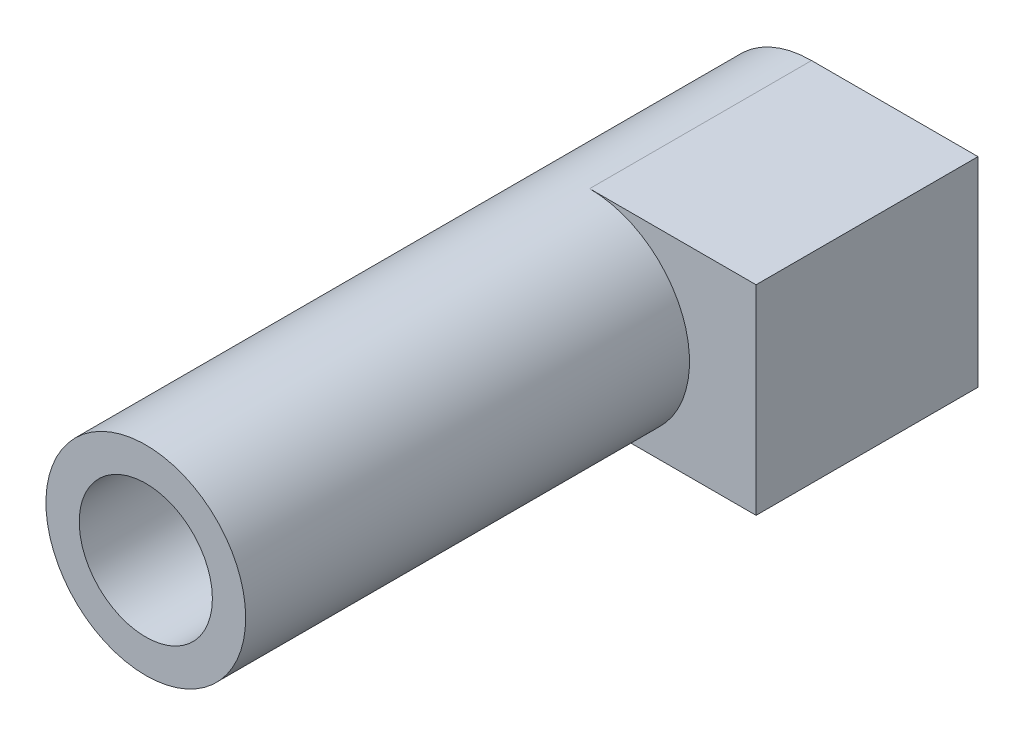
ISO-10303-21;
HEADER;
FILE_DESCRIPTION(('STEP AP214'),'2;1');
FILE_NAME('part.step','',(''),(''),'','','');
FILE_SCHEMA(('AUTOMOTIVE_DESIGN { 1 0 10303 214 1 1 1 1 }'));
ENDSEC;
DATA;
#1=APPLICATION_CONTEXT('core data for automotive mechanical design processes');
#2=APPLICATION_PROTOCOL_DEFINITION('international standard','automotive_design',2000,#1);
#3=PRODUCT_CONTEXT('',#1,'mechanical');
#4=PRODUCT('Part','Part','',(#3));
#5=PRODUCT_RELATED_PRODUCT_CATEGORY('part','',(#4));
#6=PRODUCT_DEFINITION_FORMATION('','',#4);
#7=PRODUCT_DEFINITION_CONTEXT('part definition',#1,'design');
#8=PRODUCT_DEFINITION('design','',#6,#7);
#9=PRODUCT_DEFINITION_SHAPE('','',#8);
#10=(LENGTH_UNIT() NAMED_UNIT(*) SI_UNIT(.MILLI.,.METRE.));
#11=(NAMED_UNIT(*) PLANE_ANGLE_UNIT() SI_UNIT($,.RADIAN.));
#12=(NAMED_UNIT(*) SI_UNIT($,.STERADIAN.) SOLID_ANGLE_UNIT());
#13=UNCERTAINTY_MEASURE_WITH_UNIT(LENGTH_MEASURE(1.E-05),#10,'distance_accuracy_value','');
#14=(GEOMETRIC_REPRESENTATION_CONTEXT(3) GLOBAL_UNCERTAINTY_ASSIGNED_CONTEXT((#13)) GLOBAL_UNIT_ASSIGNED_CONTEXT((#10,
#11,#12)) REPRESENTATION_CONTEXT('',''));
#15=CARTESIAN_POINT('',(0.,0.,0.));
#16=DIRECTION('',(0.,0.,1.));
#17=DIRECTION('',(1.,0.,0.));
#18=AXIS2_PLACEMENT_3D('',#15,#16,#17);
#19=CARTESIAN_POINT('',(0.,9.,20.));
#20=DIRECTION('',(0.,1.,0.));
#21=DIRECTION('',(-1.,0.,0.));
#22=AXIS2_PLACEMENT_3D('',#19,#20,#21);
#23=PLANE('',#22);
#24=DIRECTION('',(1.,0.,0.));
#25=VECTOR('',#24,1.);
#26=CARTESIAN_POINT('',(0.,9.,0.));
#27=LINE('',#26,#25);
#28=CARTESIAN_POINT('',(0.,9.,0.));
#29=VERTEX_POINT('',#28);
#30=CARTESIAN_POINT('',(15.,9.00000000000001,0.));
#31=VERTEX_POINT('',#30);
#32=EDGE_CURVE('E85',#29,#31,#27,.T.);
#33=ORIENTED_EDGE('',*,*,#32,.F.);
#34=DIRECTION('',(0.,0.,-1.));
#35=VECTOR('',#34,1.);
#36=CARTESIAN_POINT('',(0.,9.,20.));
#37=LINE('',#36,#35);
#38=CARTESIAN_POINT('',(0.,9.,20.));
#39=VERTEX_POINT('',#38);
#40=EDGE_CURVE('E11',#39,#29,#37,.T.);
#41=ORIENTED_EDGE('',*,*,#40,.F.);
#42=DIRECTION('',(1.,0.,0.));
#43=VECTOR('',#42,1.);
#44=CARTESIAN_POINT('',(0.,9.,20.));
#45=LINE('',#44,#43);
#46=CARTESIAN_POINT('',(15.,9.00000000000001,20.));
#47=VERTEX_POINT('',#46);
#48=EDGE_CURVE('E88',#39,#47,#45,.T.);
#49=ORIENTED_EDGE('',*,*,#48,.T.);
#50=DIRECTION('',(0.,0.,-1.));
#51=VECTOR('',#50,1.);
#52=CARTESIAN_POINT('',(15.,9.00000000000001,20.));
#53=LINE('',#52,#51);
#54=EDGE_CURVE('E51',#47,#31,#53,.T.);
#55=ORIENTED_EDGE('',*,*,#54,.T.);
#56=EDGE_LOOP('',(#33,#41,#49,#55));
#57=FACE_BOUND('',#56,.T.);
#58=ADVANCED_FACE('F35',(#57),#23,.T.);
#59=CARTESIAN_POINT('',(0.,0.,20.));
#60=DIRECTION('',(0.,0.,-1.));
#61=DIRECTION('',(-1.,0.,0.));
#62=AXIS2_PLACEMENT_3D('',#59,#60,#61);
#63=CYLINDRICAL_SURFACE('',#62,9.);
#64=CARTESIAN_POINT('',(0.,0.,0.));
#65=DIRECTION('',(0.,0.,1.));
#66=DIRECTION('',(1.,0.,0.));
#67=AXIS2_PLACEMENT_3D('',#64,#65,#66);
#68=CIRCLE('',#67,9.);
#69=CARTESIAN_POINT('',(0.,-9.,0.));
#70=VERTEX_POINT('',#69);
#71=EDGE_CURVE('E103',#29,#70,#68,.T.);
#72=ORIENTED_EDGE('',*,*,#71,.T.);
#73=DIRECTION('',(0.,0.,-1.));
#74=VECTOR('',#73,1.);
#75=CARTESIAN_POINT('',(0.,-9.,20.));
#76=LINE('',#75,#74);
#77=CARTESIAN_POINT('',(0.,-9.,20.));
#78=VERTEX_POINT('',#77);
#79=EDGE_CURVE('E43',#78,#70,#76,.T.);
#80=ORIENTED_EDGE('',*,*,#79,.F.);
#81=CARTESIAN_POINT('',(0.,0.,20.));
#82=DIRECTION('',(0.,0.,1.));
#83=DIRECTION('',(1.,0.,0.));
#84=AXIS2_PLACEMENT_3D('',#81,#82,#83);
#85=CIRCLE('',#84,9.);
#86=EDGE_CURVE('E75',#39,#78,#85,.F.);
#87=ORIENTED_EDGE('',*,*,#86,.F.);
#88=ORIENTED_EDGE('',*,*,#40,.T.);
#89=EDGE_LOOP('',(#72,#80,#87,#88));
#90=FACE_BOUND('',#89,.T.);
#91=CARTESIAN_POINT('',(0.,0.,60.));
#92=DIRECTION('',(0.,0.,1.));
#93=DIRECTION('',(1.,0.,0.));
#94=AXIS2_PLACEMENT_3D('',#91,#92,#93);
#95=CIRCLE('',#94,9.);
#96=CARTESIAN_POINT('',(9.,0.,60.));
#97=VERTEX_POINT('',#96);
#98=EDGE_CURVE('E86',#97,#97,#95,.T.);
#99=ORIENTED_EDGE('',*,*,#98,.F.);
#100=EDGE_LOOP('',(#99));
#101=FACE_BOUND('',#100,.T.);
#102=ADVANCED_FACE('F81',(#90,#101),#63,.T.);
#103=CARTESIAN_POINT('',(0.,-9.,20.));
#104=DIRECTION('',(0.,-1.,0.));
#105=DIRECTION('',(1.,0.,0.));
#106=AXIS2_PLACEMENT_3D('',#103,#104,#105);
#107=PLANE('',#106);
#108=DIRECTION('',(-1.,0.,0.));
#109=VECTOR('',#108,1.);
#110=CARTESIAN_POINT('',(0.,-9.,0.));
#111=LINE('',#110,#109);
#112=CARTESIAN_POINT('',(15.,-9.00000000000001,0.));
#113=VERTEX_POINT('',#112);
#114=EDGE_CURVE('E105',#113,#70,#111,.T.);
#115=ORIENTED_EDGE('',*,*,#114,.F.);
#116=DIRECTION('',(0.,0.,-1.));
#117=VECTOR('',#116,1.);
#118=CARTESIAN_POINT('',(15.,-9.00000000000001,20.));
#119=LINE('',#118,#117);
#120=CARTESIAN_POINT('',(15.,-9.00000000000001,20.));
#121=VERTEX_POINT('',#120);
#122=EDGE_CURVE('E65',#121,#113,#119,.T.);
#123=ORIENTED_EDGE('',*,*,#122,.F.);
#124=DIRECTION('',(-1.,0.,0.));
#125=VECTOR('',#124,1.);
#126=CARTESIAN_POINT('',(0.,-9.,20.));
#127=LINE('',#126,#125);
#128=EDGE_CURVE('E92',#121,#78,#127,.T.);
#129=ORIENTED_EDGE('',*,*,#128,.T.);
#130=ORIENTED_EDGE('',*,*,#79,.T.);
#131=EDGE_LOOP('',(#115,#123,#129,#130));
#132=FACE_BOUND('',#131,.T.);
#133=ADVANCED_FACE('F112',(#132),#107,.T.);
#134=CARTESIAN_POINT('',(15.,0.,20.));
#135=DIRECTION('',(1.,0.,0.));
#136=DIRECTION('',(0.,0.,-1.));
#137=AXIS2_PLACEMENT_3D('',#134,#135,#136);
#138=PLANE('',#137);
#139=DIRECTION('',(0.,-1.,0.));
#140=VECTOR('',#139,1.);
#141=CARTESIAN_POINT('',(15.,0.,0.));
#142=LINE('',#141,#140);
#143=EDGE_CURVE('E97',#31,#113,#142,.T.);
#144=ORIENTED_EDGE('',*,*,#143,.F.);
#145=ORIENTED_EDGE('',*,*,#54,.F.);
#146=DIRECTION('',(0.,-1.,0.));
#147=VECTOR('',#146,1.);
#148=CARTESIAN_POINT('',(15.,0.,20.));
#149=LINE('',#148,#147);
#150=EDGE_CURVE('E91',#47,#121,#149,.T.);
#151=ORIENTED_EDGE('',*,*,#150,.T.);
#152=ORIENTED_EDGE('',*,*,#122,.T.);
#153=EDGE_LOOP('',(#144,#145,#151,#152));
#154=FACE_BOUND('',#153,.T.);
#155=ADVANCED_FACE('F116',(#154),#138,.T.);
#156=CARTESIAN_POINT('',(0.,0.,20.));
#157=DIRECTION('',(0.,0.,-1.));
#158=DIRECTION('',(-1.,0.,0.));
#159=AXIS2_PLACEMENT_3D('',#156,#157,#158);
#160=CYLINDRICAL_SURFACE('',#159,6.);
#161=CARTESIAN_POINT('',(0.,0.,0.));
#162=DIRECTION('',(0.,0.,1.));
#163=DIRECTION('',(1.,0.,0.));
#164=AXIS2_PLACEMENT_3D('',#161,#162,#163);
#165=CIRCLE('',#164,6.);
#166=CARTESIAN_POINT('',(6.,0.,0.));
#167=VERTEX_POINT('',#166);
#168=EDGE_CURVE('E93',#167,#167,#165,.T.);
#169=ORIENTED_EDGE('',*,*,#168,.F.);
#170=EDGE_LOOP('',(#169));
#171=FACE_BOUND('',#170,.T.);
#172=CARTESIAN_POINT('',(0.,0.,60.));
#173=DIRECTION('',(0.,0.,1.));
#174=DIRECTION('',(1.,0.,0.));
#175=AXIS2_PLACEMENT_3D('',#172,#173,#174);
#176=CIRCLE('',#175,6.);
#177=CARTESIAN_POINT('',(6.,0.,60.));
#178=VERTEX_POINT('',#177);
#179=EDGE_CURVE('E181',#178,#178,#176,.T.);
#180=ORIENTED_EDGE('',*,*,#179,.T.);
#181=EDGE_LOOP('',(#180));
#182=FACE_BOUND('',#181,.T.);
#183=ADVANCED_FACE('F118',(#171,#182),#160,.F.);
#184=CARTESIAN_POINT('',(0.,0.,20.));
#185=DIRECTION('',(0.,0.,1.));
#186=DIRECTION('',(1.,0.,0.));
#187=AXIS2_PLACEMENT_3D('',#184,#185,#186);
#188=PLANE('',#187);
#189=ORIENTED_EDGE('',*,*,#48,.F.);
#190=ORIENTED_EDGE('',*,*,#86,.T.);
#191=ORIENTED_EDGE('',*,*,#128,.F.);
#192=ORIENTED_EDGE('',*,*,#150,.F.);
#193=EDGE_LOOP('',(#189,#190,#191,#192));
#194=FACE_BOUND('',#193,.T.);
#195=ADVANCED_FACE('F90',(#194),#188,.T.);
#196=CARTESIAN_POINT('',(0.,0.,0.));
#197=DIRECTION('',(0.,0.,1.));
#198=DIRECTION('',(1.,0.,0.));
#199=AXIS2_PLACEMENT_3D('',#196,#197,#198);
#200=PLANE('',#199);
#201=ORIENTED_EDGE('',*,*,#114,.T.);
#202=ORIENTED_EDGE('',*,*,#71,.F.);
#203=ORIENTED_EDGE('',*,*,#32,.T.);
#204=ORIENTED_EDGE('',*,*,#143,.T.);
#205=EDGE_LOOP('',(#201,#202,#203,#204));
#206=FACE_BOUND('',#205,.T.);
#207=ORIENTED_EDGE('',*,*,#168,.T.);
#208=EDGE_LOOP('',(#207));
#209=FACE_BOUND('',#208,.T.);
#210=ADVANCED_FACE('F114',(#206,#209),#200,.F.);
#211=CARTESIAN_POINT('',(0.,0.,60.));
#212=DIRECTION('',(0.,0.,1.));
#213=DIRECTION('',(1.,0.,0.));
#214=AXIS2_PLACEMENT_3D('',#211,#212,#213);
#215=PLANE('',#214);
#216=ORIENTED_EDGE('',*,*,#179,.F.);
#217=EDGE_LOOP('',(#216));
#218=FACE_BOUND('',#217,.T.);
#219=ORIENTED_EDGE('',*,*,#98,.T.);
#220=EDGE_LOOP('',(#219));
#221=FACE_BOUND('',#220,.T.);
#222=ADVANCED_FACE('F166',(#218,#221),#215,.T.);
#223=CLOSED_SHELL('',(#58,#102,#133,#155,#183,#195,#210,#222));
#224=MANIFOLD_SOLID_BREP('B2',#223);
#225=ADVANCED_BREP_SHAPE_REPRESENTATION('',(#18,#224),#14);
#226=SHAPE_DEFINITION_REPRESENTATION(#9,#225);
ENDSEC;
END-ISO-10303-21;
